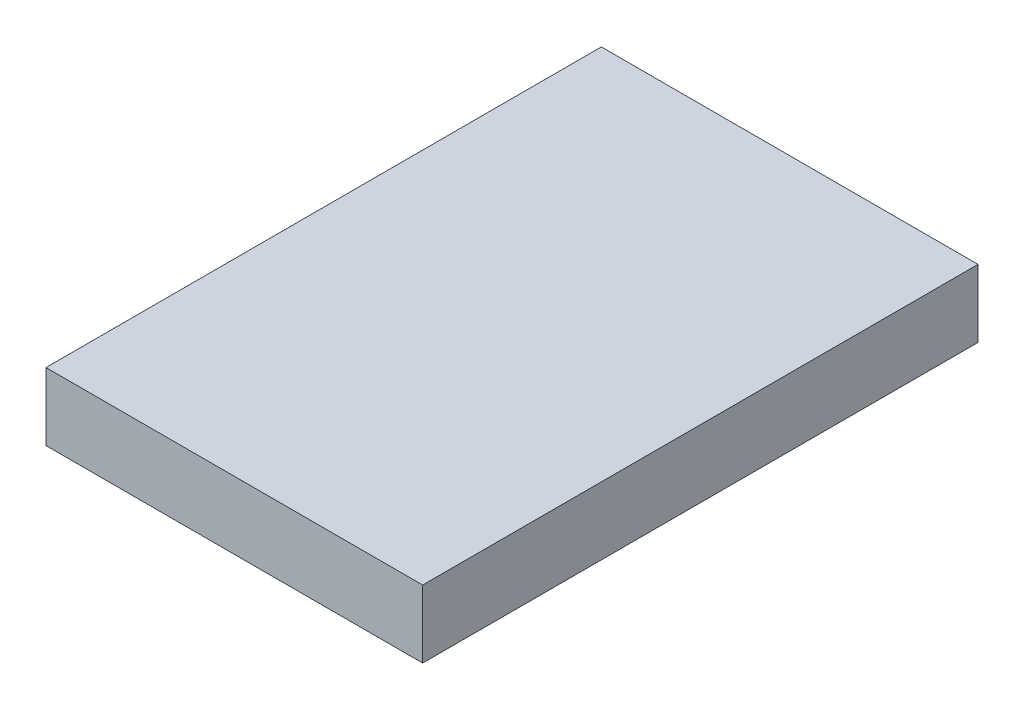
ISO-10303-21;
HEADER;
FILE_DESCRIPTION(('STEP AP214'),'2;1');
FILE_NAME('part.step','',(''),(''),'','','');
FILE_SCHEMA(('AUTOMOTIVE_DESIGN { 1 0 10303 214 1 1 1 1 }'));
ENDSEC;
DATA;
#1=APPLICATION_CONTEXT('core data for automotive mechanical design processes');
#2=APPLICATION_PROTOCOL_DEFINITION('international standard','automotive_design',2000,#1);
#3=PRODUCT_CONTEXT('',#1,'mechanical');
#4=PRODUCT('Part','Part','',(#3));
#5=PRODUCT_RELATED_PRODUCT_CATEGORY('part','',(#4));
#6=PRODUCT_DEFINITION_FORMATION('','',#4);
#7=PRODUCT_DEFINITION_CONTEXT('part definition',#1,'design');
#8=PRODUCT_DEFINITION('design','',#6,#7);
#9=PRODUCT_DEFINITION_SHAPE('','',#8);
#10=(LENGTH_UNIT() NAMED_UNIT(*) SI_UNIT(.MILLI.,.METRE.));
#11=(NAMED_UNIT(*) PLANE_ANGLE_UNIT() SI_UNIT($,.RADIAN.));
#12=(NAMED_UNIT(*) SI_UNIT($,.STERADIAN.) SOLID_ANGLE_UNIT());
#13=UNCERTAINTY_MEASURE_WITH_UNIT(LENGTH_MEASURE(1.E-05),#10,'distance_accuracy_value','');
#14=(GEOMETRIC_REPRESENTATION_CONTEXT(3) GLOBAL_UNCERTAINTY_ASSIGNED_CONTEXT((#13)) GLOBAL_UNIT_ASSIGNED_CONTEXT((#10,
#11,#12)) REPRESENTATION_CONTEXT('',''));
#15=CARTESIAN_POINT('',(0.,0.,0.));
#16=DIRECTION('',(0.,0.,1.));
#17=DIRECTION('',(1.,0.,0.));
#18=AXIS2_PLACEMENT_3D('',#15,#16,#17);
#19=CARTESIAN_POINT('',(39.,7.,57.5));
#20=DIRECTION('',(-1.,0.,0.));
#21=DIRECTION('',(0.,0.,1.));
#22=AXIS2_PLACEMENT_3D('',#19,#20,#21);
#23=PLANE('',#22);
#24=DIRECTION('',(0.,0.,-1.));
#25=VECTOR('',#24,1.);
#26=CARTESIAN_POINT('',(39.,-7.,57.5));
#27=LINE('',#26,#25);
#28=CARTESIAN_POINT('',(39.,-7.,57.5));
#29=VERTEX_POINT('',#28);
#30=CARTESIAN_POINT('',(39.,-7.,-57.5));
#31=VERTEX_POINT('',#30);
#32=EDGE_CURVE('E96',#29,#31,#27,.T.);
#33=ORIENTED_EDGE('',*,*,#32,.T.);
#34=DIRECTION('',(0.,-1.,0.));
#35=VECTOR('',#34,1.);
#36=CARTESIAN_POINT('',(39.,7.,-57.5));
#37=LINE('',#36,#35);
#38=CARTESIAN_POINT('',(39.,7.,-57.5));
#39=VERTEX_POINT('',#38);
#40=EDGE_CURVE('E11',#39,#31,#37,.T.);
#41=ORIENTED_EDGE('',*,*,#40,.F.);
#42=DIRECTION('',(0.,0.,-1.));
#43=VECTOR('',#42,1.);
#44=CARTESIAN_POINT('',(39.,7.,57.5));
#45=LINE('',#44,#43);
#46=CARTESIAN_POINT('',(39.,7.,57.5));
#47=VERTEX_POINT('',#46);
#48=EDGE_CURVE('E84',#47,#39,#45,.T.);
#49=ORIENTED_EDGE('',*,*,#48,.F.);
#50=DIRECTION('',(0.,-1.,0.));
#51=VECTOR('',#50,1.);
#52=CARTESIAN_POINT('',(39.,7.,57.5));
#53=LINE('',#52,#51);
#54=EDGE_CURVE('E92',#47,#29,#53,.T.);
#55=ORIENTED_EDGE('',*,*,#54,.T.);
#56=EDGE_LOOP('',(#33,#41,#49,#55));
#57=FACE_BOUND('',#56,.T.);
#58=ADVANCED_FACE('F33',(#57),#23,.F.);
#59=CARTESIAN_POINT('',(-39.,7.,-57.5));
#60=DIRECTION('',(0.,0.,1.));
#61=DIRECTION('',(1.,0.,0.));
#62=AXIS2_PLACEMENT_3D('',#59,#60,#61);
#63=PLANE('',#62);
#64=DIRECTION('',(-1.,0.,0.));
#65=VECTOR('',#64,1.);
#66=CARTESIAN_POINT('',(-39.,-7.,-57.5));
#67=LINE('',#66,#65);
#68=CARTESIAN_POINT('',(-39.,-7.,-57.5));
#69=VERTEX_POINT('',#68);
#70=EDGE_CURVE('E88',#31,#69,#67,.T.);
#71=ORIENTED_EDGE('',*,*,#70,.T.);
#72=DIRECTION('',(0.,-1.,0.));
#73=VECTOR('',#72,1.);
#74=CARTESIAN_POINT('',(-39.,7.,-57.5));
#75=LINE('',#74,#73);
#76=CARTESIAN_POINT('',(-39.,7.,-57.5));
#77=VERTEX_POINT('',#76);
#78=EDGE_CURVE('E41',#77,#69,#75,.T.);
#79=ORIENTED_EDGE('',*,*,#78,.F.);
#80=DIRECTION('',(-1.,0.,0.));
#81=VECTOR('',#80,1.);
#82=CARTESIAN_POINT('',(-39.,7.,-57.5));
#83=LINE('',#82,#81);
#84=EDGE_CURVE('E79',#39,#77,#83,.T.);
#85=ORIENTED_EDGE('',*,*,#84,.F.);
#86=ORIENTED_EDGE('',*,*,#40,.T.);
#87=EDGE_LOOP('',(#71,#79,#85,#86));
#88=FACE_BOUND('',#87,.T.);
#89=ADVANCED_FACE('F87',(#88),#63,.F.);
#90=CARTESIAN_POINT('',(-39.,7.,57.5));
#91=DIRECTION('',(1.,0.,0.));
#92=DIRECTION('',(0.,0.,-1.));
#93=AXIS2_PLACEMENT_3D('',#90,#91,#92);
#94=PLANE('',#93);
#95=DIRECTION('',(0.,0.,1.));
#96=VECTOR('',#95,1.);
#97=CARTESIAN_POINT('',(-39.,-7.,57.5));
#98=LINE('',#97,#96);
#99=CARTESIAN_POINT('',(-39.,-7.,57.5));
#100=VERTEX_POINT('',#99);
#101=EDGE_CURVE('E66',#69,#100,#98,.T.);
#102=ORIENTED_EDGE('',*,*,#101,.T.);
#103=DIRECTION('',(0.,-1.,0.));
#104=VECTOR('',#103,1.);
#105=CARTESIAN_POINT('',(-39.,7.,57.5));
#106=LINE('',#105,#104);
#107=CARTESIAN_POINT('',(-39.,7.,57.5));
#108=VERTEX_POINT('',#107);
#109=EDGE_CURVE('E89',#108,#100,#106,.T.);
#110=ORIENTED_EDGE('',*,*,#109,.F.);
#111=DIRECTION('',(0.,0.,1.));
#112=VECTOR('',#111,1.);
#113=CARTESIAN_POINT('',(-39.,7.,57.5));
#114=LINE('',#113,#112);
#115=EDGE_CURVE('E82',#77,#108,#114,.T.);
#116=ORIENTED_EDGE('',*,*,#115,.F.);
#117=ORIENTED_EDGE('',*,*,#78,.T.);
#118=EDGE_LOOP('',(#102,#110,#116,#117));
#119=FACE_BOUND('',#118,.T.);
#120=ADVANCED_FACE('F90',(#119),#94,.F.);
#121=CARTESIAN_POINT('',(-39.,7.,57.5));
#122=DIRECTION('',(0.,0.,-1.));
#123=DIRECTION('',(-1.,0.,0.));
#124=AXIS2_PLACEMENT_3D('',#121,#122,#123);
#125=PLANE('',#124);
#126=DIRECTION('',(1.,0.,0.));
#127=VECTOR('',#126,1.);
#128=CARTESIAN_POINT('',(-39.,-7.,57.5));
#129=LINE('',#128,#127);
#130=EDGE_CURVE('E72',#100,#29,#129,.T.);
#131=ORIENTED_EDGE('',*,*,#130,.T.);
#132=ORIENTED_EDGE('',*,*,#54,.F.);
#133=DIRECTION('',(1.,0.,0.));
#134=VECTOR('',#133,1.);
#135=CARTESIAN_POINT('',(-39.,7.,57.5));
#136=LINE('',#135,#134);
#137=EDGE_CURVE('E49',#108,#47,#136,.T.);
#138=ORIENTED_EDGE('',*,*,#137,.F.);
#139=ORIENTED_EDGE('',*,*,#109,.T.);
#140=EDGE_LOOP('',(#131,#132,#138,#139));
#141=FACE_BOUND('',#140,.T.);
#142=ADVANCED_FACE('F103',(#141),#125,.F.);
#143=CARTESIAN_POINT('',(0.,7.,0.));
#144=DIRECTION('',(0.,-1.,0.));
#145=DIRECTION('',(0.,0.,-1.));
#146=AXIS2_PLACEMENT_3D('',#143,#144,#145);
#147=PLANE('',#146);
#148=ORIENTED_EDGE('',*,*,#48,.T.);
#149=ORIENTED_EDGE('',*,*,#84,.T.);
#150=ORIENTED_EDGE('',*,*,#115,.T.);
#151=ORIENTED_EDGE('',*,*,#137,.T.);
#152=EDGE_LOOP('',(#148,#149,#150,#151));
#153=FACE_BOUND('',#152,.T.);
#154=ADVANCED_FACE('F80',(#153),#147,.F.);
#155=CARTESIAN_POINT('',(0.,-7.,0.));
#156=DIRECTION('',(0.,-1.,0.));
#157=DIRECTION('',(0.,0.,-1.));
#158=AXIS2_PLACEMENT_3D('',#155,#156,#157);
#159=PLANE('',#158);
#160=ORIENTED_EDGE('',*,*,#32,.F.);
#161=ORIENTED_EDGE('',*,*,#130,.F.);
#162=ORIENTED_EDGE('',*,*,#101,.F.);
#163=ORIENTED_EDGE('',*,*,#70,.F.);
#164=EDGE_LOOP('',(#160,#161,#162,#163));
#165=FACE_BOUND('',#164,.T.);
#166=ADVANCED_FACE('F106',(#165),#159,.T.);
#167=CLOSED_SHELL('',(#58,#89,#120,#142,#154,#166));
#168=MANIFOLD_SOLID_BREP('B2',#167);
#169=ADVANCED_BREP_SHAPE_REPRESENTATION('',(#18,#168),#14);
#170=SHAPE_DEFINITION_REPRESENTATION(#9,#169);
ENDSEC;
END-ISO-10303-21;
